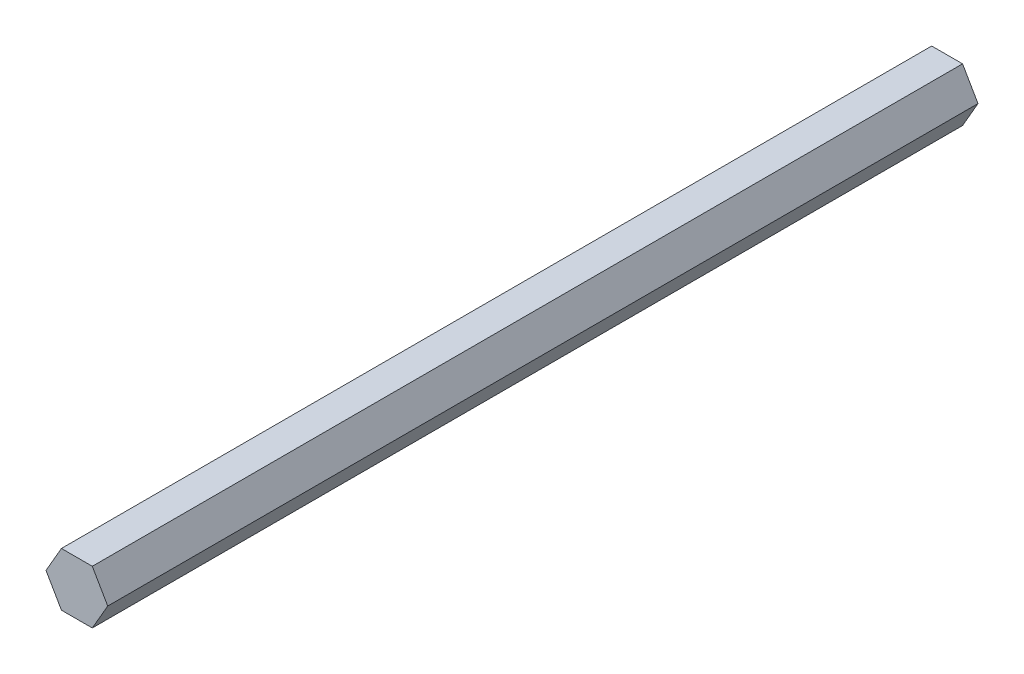
ISO-10303-21;
HEADER;
FILE_DESCRIPTION(('STEP AP214'),'2;1');
FILE_NAME('part.step','',(''),(''),'','','');
FILE_SCHEMA(('AUTOMOTIVE_DESIGN { 1 0 10303 214 1 1 1 1 }'));
ENDSEC;
DATA;
#1=APPLICATION_CONTEXT('core data for automotive mechanical design processes');
#2=APPLICATION_PROTOCOL_DEFINITION('international standard','automotive_design',2000,#1);
#3=PRODUCT_CONTEXT('',#1,'mechanical');
#4=PRODUCT('Part','Part','',(#3));
#5=PRODUCT_RELATED_PRODUCT_CATEGORY('part','',(#4));
#6=PRODUCT_DEFINITION_FORMATION('','',#4);
#7=PRODUCT_DEFINITION_CONTEXT('part definition',#1,'design');
#8=PRODUCT_DEFINITION('design','',#6,#7);
#9=PRODUCT_DEFINITION_SHAPE('','',#8);
#10=(LENGTH_UNIT() NAMED_UNIT(*) SI_UNIT(.MILLI.,.METRE.));
#11=(NAMED_UNIT(*) PLANE_ANGLE_UNIT() SI_UNIT($,.RADIAN.));
#12=(NAMED_UNIT(*) SI_UNIT($,.STERADIAN.) SOLID_ANGLE_UNIT());
#13=UNCERTAINTY_MEASURE_WITH_UNIT(LENGTH_MEASURE(1.E-05),#10,'distance_accuracy_value','');
#14=(GEOMETRIC_REPRESENTATION_CONTEXT(3) GLOBAL_UNCERTAINTY_ASSIGNED_CONTEXT((#13)) GLOBAL_UNIT_ASSIGNED_CONTEXT((#10,
#11,#12)) REPRESENTATION_CONTEXT('',''));
#15=CARTESIAN_POINT('',(0.,0.,0.));
#16=DIRECTION('',(0.,0.,1.));
#17=DIRECTION('',(1.,0.,0.));
#18=AXIS2_PLACEMENT_3D('',#15,#16,#17);
#19=CARTESIAN_POINT('',(7.33234841870825,0.,103.378));
#20=DIRECTION('',(-0.866025403784439,-0.5,0.));
#21=DIRECTION('',(0.5,-0.866025403784439,0.));
#22=AXIS2_PLACEMENT_3D('',#19,#20,#21);
#23=PLANE('',#22);
#24=DIRECTION('',(-0.5,0.866025403784439,0.));
#25=VECTOR('',#24,1.);
#26=CARTESIAN_POINT('',(7.33234841870825,0.,-103.378));
#27=LINE('',#26,#25);
#28=CARTESIAN_POINT('',(7.33234841870825,0.,-103.378));
#29=VERTEX_POINT('',#28);
#30=CARTESIAN_POINT('',(3.66617420935413,6.35,-103.378));
#31=VERTEX_POINT('',#30);
#32=EDGE_CURVE('E116',#29,#31,#27,.T.);
#33=ORIENTED_EDGE('',*,*,#32,.T.);
#34=DIRECTION('',(0.,0.,-1.));
#35=VECTOR('',#34,1.);
#36=CARTESIAN_POINT('',(3.66617420935413,6.35,103.378));
#37=LINE('',#36,#35);
#38=CARTESIAN_POINT('',(3.66617420935413,6.35,103.378));
#39=VERTEX_POINT('',#38);
#40=EDGE_CURVE('E11',#39,#31,#37,.T.);
#41=ORIENTED_EDGE('',*,*,#40,.F.);
#42=DIRECTION('',(-0.5,0.866025403784439,0.));
#43=VECTOR('',#42,1.);
#44=CARTESIAN_POINT('',(7.33234841870825,0.,103.378));
#45=LINE('',#44,#43);
#46=CARTESIAN_POINT('',(7.33234841870825,0.,103.378));
#47=VERTEX_POINT('',#46);
#48=EDGE_CURVE('E126',#47,#39,#45,.T.);
#49=ORIENTED_EDGE('',*,*,#48,.F.);
#50=DIRECTION('',(0.,0.,-1.));
#51=VECTOR('',#50,1.);
#52=CARTESIAN_POINT('',(7.33234841870825,0.,103.378));
#53=LINE('',#52,#51);
#54=EDGE_CURVE('E112',#47,#29,#53,.T.);
#55=ORIENTED_EDGE('',*,*,#54,.T.);
#56=EDGE_LOOP('',(#33,#41,#49,#55));
#57=FACE_BOUND('',#56,.T.);
#58=ADVANCED_FACE('F32',(#57),#23,.F.);
#59=CARTESIAN_POINT('',(3.66617420935413,6.35,103.378));
#60=DIRECTION('',(0.,-1.,0.));
#61=DIRECTION('',(1.,0.,0.));
#62=AXIS2_PLACEMENT_3D('',#59,#60,#61);
#63=PLANE('',#62);
#64=DIRECTION('',(-1.,0.,0.));
#65=VECTOR('',#64,1.);
#66=CARTESIAN_POINT('',(3.66617420935413,6.35,-103.378));
#67=LINE('',#66,#65);
#68=CARTESIAN_POINT('',(-3.66617420935412,6.35,-103.378));
#69=VERTEX_POINT('',#68);
#70=EDGE_CURVE('E119',#31,#69,#67,.T.);
#71=ORIENTED_EDGE('',*,*,#70,.T.);
#72=DIRECTION('',(0.,0.,-1.));
#73=VECTOR('',#72,1.);
#74=CARTESIAN_POINT('',(-3.66617420935412,6.35,103.378));
#75=LINE('',#74,#73);
#76=CARTESIAN_POINT('',(-3.66617420935412,6.35,103.378));
#77=VERTEX_POINT('',#76);
#78=EDGE_CURVE('E40',#77,#69,#75,.T.);
#79=ORIENTED_EDGE('',*,*,#78,.F.);
#80=DIRECTION('',(-1.,0.,0.));
#81=VECTOR('',#80,1.);
#82=CARTESIAN_POINT('',(3.66617420935413,6.35,103.378));
#83=LINE('',#82,#81);
#84=EDGE_CURVE('E85',#39,#77,#83,.T.);
#85=ORIENTED_EDGE('',*,*,#84,.F.);
#86=ORIENTED_EDGE('',*,*,#40,.T.);
#87=EDGE_LOOP('',(#71,#79,#85,#86));
#88=FACE_BOUND('',#87,.T.);
#89=ADVANCED_FACE('F150',(#88),#63,.F.);
#90=CARTESIAN_POINT('',(-3.66617420935412,6.35,103.378));
#91=DIRECTION('',(0.866025403784439,-0.5,0.));
#92=DIRECTION('',(0.5,0.866025403784439,0.));
#93=AXIS2_PLACEMENT_3D('',#90,#91,#92);
#94=PLANE('',#93);
#95=DIRECTION('',(-0.5,-0.866025403784439,0.));
#96=VECTOR('',#95,1.);
#97=CARTESIAN_POINT('',(-3.66617420935412,6.35,-103.378));
#98=LINE('',#97,#96);
#99=CARTESIAN_POINT('',(-7.33234841870824,0.,-103.378));
#100=VERTEX_POINT('',#99);
#101=EDGE_CURVE('E121',#69,#100,#98,.T.);
#102=ORIENTED_EDGE('',*,*,#101,.T.);
#103=DIRECTION('',(0.,0.,-1.));
#104=VECTOR('',#103,1.);
#105=CARTESIAN_POINT('',(-7.33234841870824,0.,103.378));
#106=LINE('',#105,#104);
#107=CARTESIAN_POINT('',(-7.33234841870824,0.,103.378));
#108=VERTEX_POINT('',#107);
#109=EDGE_CURVE('E107',#108,#100,#106,.T.);
#110=ORIENTED_EDGE('',*,*,#109,.F.);
#111=DIRECTION('',(-0.5,-0.866025403784439,0.));
#112=VECTOR('',#111,1.);
#113=CARTESIAN_POINT('',(-3.66617420935412,6.35,103.378));
#114=LINE('',#113,#112);
#115=EDGE_CURVE('E98',#77,#108,#114,.T.);
#116=ORIENTED_EDGE('',*,*,#115,.F.);
#117=ORIENTED_EDGE('',*,*,#78,.T.);
#118=EDGE_LOOP('',(#102,#110,#116,#117));
#119=FACE_BOUND('',#118,.T.);
#120=ADVANCED_FACE('F132',(#119),#94,.F.);
#121=CARTESIAN_POINT('',(-7.33234841870824,0.,103.378));
#122=DIRECTION('',(0.866025403784439,0.5,0.));
#123=DIRECTION('',(-0.5,0.866025403784439,0.));
#124=AXIS2_PLACEMENT_3D('',#121,#122,#123);
#125=PLANE('',#124);
#126=DIRECTION('',(0.5,-0.866025403784439,0.));
#127=VECTOR('',#126,1.);
#128=CARTESIAN_POINT('',(-7.33234841870824,0.,-103.378));
#129=LINE('',#128,#127);
#130=CARTESIAN_POINT('',(-3.66617420935412,-6.35,-103.378));
#131=VERTEX_POINT('',#130);
#132=EDGE_CURVE('E106',#100,#131,#129,.T.);
#133=ORIENTED_EDGE('',*,*,#132,.T.);
#134=DIRECTION('',(0.,0.,-1.));
#135=VECTOR('',#134,1.);
#136=CARTESIAN_POINT('',(-3.66617420935412,-6.35,103.378));
#137=LINE('',#136,#135);
#138=CARTESIAN_POINT('',(-3.66617420935412,-6.35,103.378));
#139=VERTEX_POINT('',#138);
#140=EDGE_CURVE('E103',#139,#131,#137,.T.);
#141=ORIENTED_EDGE('',*,*,#140,.F.);
#142=DIRECTION('',(0.5,-0.866025403784439,0.));
#143=VECTOR('',#142,1.);
#144=CARTESIAN_POINT('',(-7.33234841870824,0.,103.378));
#145=LINE('',#144,#143);
#146=EDGE_CURVE('E92',#108,#139,#145,.T.);
#147=ORIENTED_EDGE('',*,*,#146,.F.);
#148=ORIENTED_EDGE('',*,*,#109,.T.);
#149=EDGE_LOOP('',(#133,#141,#147,#148));
#150=FACE_BOUND('',#149,.T.);
#151=ADVANCED_FACE('F104',(#150),#125,.F.);
#152=CARTESIAN_POINT('',(-3.66617420935412,-6.35,103.378));
#153=DIRECTION('',(0.,1.,0.));
#154=DIRECTION('',(-1.,0.,0.));
#155=AXIS2_PLACEMENT_3D('',#152,#153,#154);
#156=PLANE('',#155);
#157=DIRECTION('',(1.,0.,0.));
#158=VECTOR('',#157,1.);
#159=CARTESIAN_POINT('',(-3.66617420935412,-6.35,-103.378));
#160=LINE('',#159,#158);
#161=CARTESIAN_POINT('',(3.66617420935412,-6.35,-103.378));
#162=VERTEX_POINT('',#161);
#163=EDGE_CURVE('E71',#131,#162,#160,.T.);
#164=ORIENTED_EDGE('',*,*,#163,.T.);
#165=DIRECTION('',(0.,0.,-1.));
#166=VECTOR('',#165,1.);
#167=CARTESIAN_POINT('',(3.66617420935412,-6.35,103.378));
#168=LINE('',#167,#166);
#169=CARTESIAN_POINT('',(3.66617420935412,-6.35,103.378));
#170=VERTEX_POINT('',#169);
#171=EDGE_CURVE('E108',#170,#162,#168,.T.);
#172=ORIENTED_EDGE('',*,*,#171,.F.);
#173=DIRECTION('',(1.,0.,0.));
#174=VECTOR('',#173,1.);
#175=CARTESIAN_POINT('',(-3.66617420935412,-6.35,103.378));
#176=LINE('',#175,#174);
#177=EDGE_CURVE('E96',#139,#170,#176,.T.);
#178=ORIENTED_EDGE('',*,*,#177,.F.);
#179=ORIENTED_EDGE('',*,*,#140,.T.);
#180=EDGE_LOOP('',(#164,#172,#178,#179));
#181=FACE_BOUND('',#180,.T.);
#182=ADVANCED_FACE('F110',(#181),#156,.F.);
#183=CARTESIAN_POINT('',(3.66617420935412,-6.35,103.378));
#184=DIRECTION('',(-0.866025403784439,0.5,0.));
#185=DIRECTION('',(-0.5,-0.866025403784439,0.));
#186=AXIS2_PLACEMENT_3D('',#183,#184,#185);
#187=PLANE('',#186);
#188=DIRECTION('',(0.5,0.866025403784439,0.));
#189=VECTOR('',#188,1.);
#190=CARTESIAN_POINT('',(3.66617420935412,-6.35,-103.378));
#191=LINE('',#190,#189);
#192=EDGE_CURVE('E77',#162,#29,#191,.T.);
#193=ORIENTED_EDGE('',*,*,#192,.T.);
#194=ORIENTED_EDGE('',*,*,#54,.F.);
#195=DIRECTION('',(0.5,0.866025403784439,0.));
#196=VECTOR('',#195,1.);
#197=CARTESIAN_POINT('',(3.66617420935412,-6.35,103.378));
#198=LINE('',#197,#196);
#199=EDGE_CURVE('E48',#170,#47,#198,.T.);
#200=ORIENTED_EDGE('',*,*,#199,.F.);
#201=ORIENTED_EDGE('',*,*,#171,.T.);
#202=EDGE_LOOP('',(#193,#194,#200,#201));
#203=FACE_BOUND('',#202,.T.);
#204=ADVANCED_FACE('F139',(#203),#187,.F.);
#205=CARTESIAN_POINT('',(0.,0.,103.378));
#206=DIRECTION('',(0.,0.,1.));
#207=DIRECTION('',(1.,0.,0.));
#208=AXIS2_PLACEMENT_3D('',#205,#206,#207);
#209=PLANE('',#208);
#210=ORIENTED_EDGE('',*,*,#48,.T.);
#211=ORIENTED_EDGE('',*,*,#84,.T.);
#212=ORIENTED_EDGE('',*,*,#115,.T.);
#213=ORIENTED_EDGE('',*,*,#146,.T.);
#214=ORIENTED_EDGE('',*,*,#177,.T.);
#215=ORIENTED_EDGE('',*,*,#199,.T.);
#216=EDGE_LOOP('',(#210,#211,#212,#213,#214,#215));
#217=FACE_BOUND('',#216,.T.);
#218=ADVANCED_FACE('F94',(#217),#209,.T.);
#219=CARTESIAN_POINT('',(0.,0.,-103.378));
#220=DIRECTION('',(0.,0.,1.));
#221=DIRECTION('',(1.,0.,0.));
#222=AXIS2_PLACEMENT_3D('',#219,#220,#221);
#223=PLANE('',#222);
#224=ORIENTED_EDGE('',*,*,#32,.F.);
#225=ORIENTED_EDGE('',*,*,#192,.F.);
#226=ORIENTED_EDGE('',*,*,#163,.F.);
#227=ORIENTED_EDGE('',*,*,#132,.F.);
#228=ORIENTED_EDGE('',*,*,#101,.F.);
#229=ORIENTED_EDGE('',*,*,#70,.F.);
#230=EDGE_LOOP('',(#224,#225,#226,#227,#228,#229));
#231=FACE_BOUND('',#230,.T.);
#232=ADVANCED_FACE('F135',(#231),#223,.F.);
#233=CLOSED_SHELL('',(#58,#89,#120,#151,#182,#204,#218,#232));
#234=MANIFOLD_SOLID_BREP('B2',#233);
#235=ADVANCED_BREP_SHAPE_REPRESENTATION('',(#18,#234),#14);
#236=SHAPE_DEFINITION_REPRESENTATION(#9,#235);
ENDSEC;
END-ISO-10303-21;
